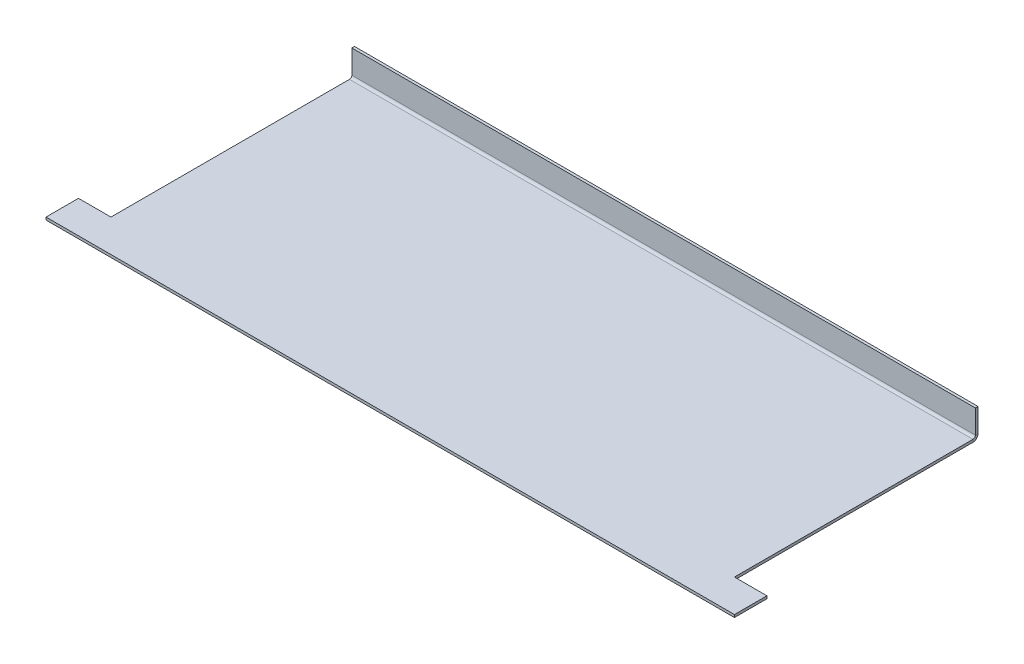
ISO-10303-21;
HEADER;
FILE_DESCRIPTION(('STEP AP214'),'2;1');
FILE_NAME('part.step','',(''),(''),'','','');
FILE_SCHEMA(('AUTOMOTIVE_DESIGN { 1 0 10303 214 1 1 1 1 }'));
ENDSEC;
DATA;
#1=APPLICATION_CONTEXT('core data for automotive mechanical design processes');
#2=APPLICATION_PROTOCOL_DEFINITION('international standard','automotive_design',2000,#1);
#3=PRODUCT_CONTEXT('',#1,'mechanical');
#4=PRODUCT('Part','Part','',(#3));
#5=PRODUCT_RELATED_PRODUCT_CATEGORY('part','',(#4));
#6=PRODUCT_DEFINITION_FORMATION('','',#4);
#7=PRODUCT_DEFINITION_CONTEXT('part definition',#1,'design');
#8=PRODUCT_DEFINITION('design','',#6,#7);
#9=PRODUCT_DEFINITION_SHAPE('','',#8);
#10=(LENGTH_UNIT() NAMED_UNIT(*) SI_UNIT(.MILLI.,.METRE.));
#11=(NAMED_UNIT(*) PLANE_ANGLE_UNIT() SI_UNIT($,.RADIAN.));
#12=(NAMED_UNIT(*) SI_UNIT($,.STERADIAN.) SOLID_ANGLE_UNIT());
#13=UNCERTAINTY_MEASURE_WITH_UNIT(LENGTH_MEASURE(1.E-05),#10,'distance_accuracy_value','');
#14=(GEOMETRIC_REPRESENTATION_CONTEXT(3) GLOBAL_UNCERTAINTY_ASSIGNED_CONTEXT((#13)) GLOBAL_UNIT_ASSIGNED_CONTEXT((#10,
#11,#12)) REPRESENTATION_CONTEXT('',''));
#15=CARTESIAN_POINT('',(0.,0.,0.));
#16=DIRECTION('',(0.,0.,1.));
#17=DIRECTION('',(1.,0.,0.));
#18=AXIS2_PLACEMENT_3D('',#15,#16,#17);
#19=CARTESIAN_POINT('',(0.,-0.81,0.));
#20=DIRECTION('',(0.,-1.,0.));
#21=DIRECTION('',(0.,0.,-1.));
#22=AXIS2_PLACEMENT_3D('',#19,#20,#21);
#23=PLANE('',#22);
#24=DIRECTION('',(0.,0.,-1.));
#25=VECTOR('',#24,1.);
#26=CARTESIAN_POINT('',(10.,-0.81,-85.));
#27=LINE('',#26,#25);
#28=CARTESIAN_POINT('',(10.,-0.81,-9.99999999999998));
#29=VERTEX_POINT('',#28);
#30=CARTESIAN_POINT('',(10.,-0.809999999999991,-83.4534));
#31=VERTEX_POINT('',#30);
#32=EDGE_CURVE('E132',#29,#31,#27,.T.);
#33=ORIENTED_EDGE('',*,*,#32,.T.);
#34=DIRECTION('',(-1.,0.,0.));
#35=VECTOR('',#34,1.);
#36=CARTESIAN_POINT('',(10.,-0.809999999999991,-83.4534));
#37=LINE('',#36,#35);
#38=CARTESIAN_POINT('',(202.,-0.81,-83.4534));
#39=VERTEX_POINT('',#38);
#40=EDGE_CURVE('E171',#31,#39,#37,.F.);
#41=ORIENTED_EDGE('',*,*,#40,.T.);
#42=DIRECTION('',(0.,0.,1.));
#43=VECTOR('',#42,1.);
#44=CARTESIAN_POINT('',(202.,-0.81,-85.));
#45=LINE('',#44,#43);
#46=CARTESIAN_POINT('',(202.,-0.81,-9.99999999999999));
#47=VERTEX_POINT('',#46);
#48=EDGE_CURVE('E148',#39,#47,#45,.T.);
#49=ORIENTED_EDGE('',*,*,#48,.T.);
#50=DIRECTION('',(1.,0.,0.));
#51=VECTOR('',#50,1.);
#52=CARTESIAN_POINT('',(212.,-0.81,-10.));
#53=LINE('',#52,#51);
#54=CARTESIAN_POINT('',(212.,-0.81,-10.));
#55=VERTEX_POINT('',#54);
#56=EDGE_CURVE('E145',#47,#55,#53,.T.);
#57=ORIENTED_EDGE('',*,*,#56,.T.);
#58=DIRECTION('',(0.,0.,-1.));
#59=VECTOR('',#58,1.);
#60=CARTESIAN_POINT('',(212.,-0.81,0.));
#61=LINE('',#60,#59);
#62=CARTESIAN_POINT('',(212.,-0.81,0.));
#63=VERTEX_POINT('',#62);
#64=EDGE_CURVE('E117',#63,#55,#61,.T.);
#65=ORIENTED_EDGE('',*,*,#64,.F.);
#66=DIRECTION('',(1.,0.,0.));
#67=VECTOR('',#66,1.);
#68=CARTESIAN_POINT('',(0.,-0.81,0.));
#69=LINE('',#68,#67);
#70=CARTESIAN_POINT('',(0.,-0.81,0.));
#71=VERTEX_POINT('',#70);
#72=EDGE_CURVE('E96',#71,#63,#69,.T.);
#73=ORIENTED_EDGE('',*,*,#72,.F.);
#74=DIRECTION('',(0.,0.,1.));
#75=VECTOR('',#74,1.);
#76=CARTESIAN_POINT('',(0.,-0.81,0.));
#77=LINE('',#76,#75);
#78=CARTESIAN_POINT('',(0.,-0.81,-9.99999999999998));
#79=VERTEX_POINT('',#78);
#80=EDGE_CURVE('E106',#79,#71,#77,.T.);
#81=ORIENTED_EDGE('',*,*,#80,.F.);
#82=DIRECTION('',(1.,0.,0.));
#83=VECTOR('',#82,1.);
#84=CARTESIAN_POINT('',(0.,-0.81,-9.99999999999998));
#85=LINE('',#84,#83);
#86=EDGE_CURVE('E114',#79,#29,#85,.T.);
#87=ORIENTED_EDGE('',*,*,#86,.T.);
#88=EDGE_LOOP('',(#33,#41,#49,#57,#65,#73,#81,#87));
#89=FACE_BOUND('',#88,.T.);
#90=ADVANCED_FACE('F56',(#89),#23,.T.);
#91=CARTESIAN_POINT('',(0.,0.,0.));
#92=DIRECTION('',(0.,-1.,0.));
#93=DIRECTION('',(0.,0.,-1.));
#94=AXIS2_PLACEMENT_3D('',#91,#92,#93);
#95=PLANE('',#94);
#96=DIRECTION('',(-1.,0.,0.));
#97=VECTOR('',#96,1.);
#98=CARTESIAN_POINT('',(10.,0.,-83.4534));
#99=LINE('',#98,#97);
#100=CARTESIAN_POINT('',(10.,0.,-83.4534));
#101=VERTEX_POINT('',#100);
#102=CARTESIAN_POINT('',(202.,0.,-83.4534));
#103=VERTEX_POINT('',#102);
#104=EDGE_CURVE('E161',#101,#103,#99,.F.);
#105=ORIENTED_EDGE('',*,*,#104,.F.);
#106=DIRECTION('',(0.,0.,-1.));
#107=VECTOR('',#106,1.);
#108=CARTESIAN_POINT('',(10.,0.,-85.));
#109=LINE('',#108,#107);
#110=CARTESIAN_POINT('',(10.,0.,-9.99999999999998));
#111=VERTEX_POINT('',#110);
#112=EDGE_CURVE('E125',#111,#101,#109,.T.);
#113=ORIENTED_EDGE('',*,*,#112,.F.);
#114=DIRECTION('',(1.,0.,0.));
#115=VECTOR('',#114,1.);
#116=CARTESIAN_POINT('',(0.,0.,-9.99999999999998));
#117=LINE('',#116,#115);
#118=CARTESIAN_POINT('',(0.,0.,-9.99999999999998));
#119=VERTEX_POINT('',#118);
#120=EDGE_CURVE('E130',#119,#111,#117,.T.);
#121=ORIENTED_EDGE('',*,*,#120,.F.);
#122=DIRECTION('',(0.,0.,1.));
#123=VECTOR('',#122,1.);
#124=CARTESIAN_POINT('',(0.,0.,0.));
#125=LINE('',#124,#123);
#126=CARTESIAN_POINT('',(0.,0.,0.));
#127=VERTEX_POINT('',#126);
#128=EDGE_CURVE('E111',#119,#127,#125,.T.);
#129=ORIENTED_EDGE('',*,*,#128,.T.);
#130=DIRECTION('',(1.,0.,0.));
#131=VECTOR('',#130,1.);
#132=CARTESIAN_POINT('',(0.,0.,0.));
#133=LINE('',#132,#131);
#134=CARTESIAN_POINT('',(212.,0.,0.));
#135=VERTEX_POINT('',#134);
#136=EDGE_CURVE('E94',#127,#135,#133,.T.);
#137=ORIENTED_EDGE('',*,*,#136,.T.);
#138=DIRECTION('',(0.,0.,-1.));
#139=VECTOR('',#138,1.);
#140=CARTESIAN_POINT('',(212.,0.,0.));
#141=LINE('',#140,#139);
#142=CARTESIAN_POINT('',(212.,0.,-10.));
#143=VERTEX_POINT('',#142);
#144=EDGE_CURVE('E99',#135,#143,#141,.T.);
#145=ORIENTED_EDGE('',*,*,#144,.T.);
#146=DIRECTION('',(1.,0.,0.));
#147=VECTOR('',#146,1.);
#148=CARTESIAN_POINT('',(212.,0.,-10.));
#149=LINE('',#148,#147);
#150=CARTESIAN_POINT('',(202.,0.,-10.));
#151=VERTEX_POINT('',#150);
#152=EDGE_CURVE('E138',#151,#143,#149,.T.);
#153=ORIENTED_EDGE('',*,*,#152,.F.);
#154=DIRECTION('',(0.,0.,1.));
#155=VECTOR('',#154,1.);
#156=CARTESIAN_POINT('',(202.,0.,-85.));
#157=LINE('',#156,#155);
#158=EDGE_CURVE('E142',#103,#151,#157,.T.);
#159=ORIENTED_EDGE('',*,*,#158,.F.);
#160=EDGE_LOOP('',(#105,#113,#121,#129,#137,#145,#153,#159));
#161=FACE_BOUND('',#160,.T.);
#162=ADVANCED_FACE('F109',(#161),#95,.F.);
#163=CARTESIAN_POINT('',(10.,-0.811,-85.));
#164=DIRECTION('',(1.,0.,0.));
#165=DIRECTION('',(0.,0.,-1.));
#166=AXIS2_PLACEMENT_3D('',#163,#164,#165);
#167=PLANE('',#166);
#168=DIRECTION('',(0.,-1.,0.));
#169=VECTOR('',#168,1.);
#170=CARTESIAN_POINT('',(10.,0.,-83.4534));
#171=LINE('',#170,#169);
#172=EDGE_CURVE('E152',#101,#31,#171,.T.);
#173=ORIENTED_EDGE('',*,*,#172,.T.);
#174=ORIENTED_EDGE('',*,*,#32,.F.);
#175=DIRECTION('',(0.,1.,0.));
#176=VECTOR('',#175,1.);
#177=CARTESIAN_POINT('',(10.,-0.811,-9.99999999999998));
#178=LINE('',#177,#176);
#179=EDGE_CURVE('E123',#29,#111,#178,.T.);
#180=ORIENTED_EDGE('',*,*,#179,.T.);
#181=ORIENTED_EDGE('',*,*,#112,.T.);
#182=EDGE_LOOP('',(#173,#174,#180,#181));
#183=FACE_BOUND('',#182,.T.);
#184=ADVANCED_FACE('F263',(#183),#167,.F.);
#185=CARTESIAN_POINT('',(202.,-0.811,-85.));
#186=DIRECTION('',(-1.,0.,0.));
#187=DIRECTION('',(0.,0.,1.));
#188=AXIS2_PLACEMENT_3D('',#185,#186,#187);
#189=PLANE('',#188);
#190=DIRECTION('',(0.,-1.,0.));
#191=VECTOR('',#190,1.);
#192=CARTESIAN_POINT('',(202.,0.,-83.4534));
#193=LINE('',#192,#191);
#194=EDGE_CURVE('E151',#103,#39,#193,.T.);
#195=ORIENTED_EDGE('',*,*,#194,.F.);
#196=ORIENTED_EDGE('',*,*,#158,.T.);
#197=DIRECTION('',(0.,1.,0.));
#198=VECTOR('',#197,1.);
#199=CARTESIAN_POINT('',(202.,-0.811,-10.));
#200=LINE('',#199,#198);
#201=EDGE_CURVE('E135',#47,#151,#200,.T.);
#202=ORIENTED_EDGE('',*,*,#201,.F.);
#203=ORIENTED_EDGE('',*,*,#48,.F.);
#204=EDGE_LOOP('',(#195,#196,#202,#203));
#205=FACE_BOUND('',#204,.T.);
#206=ADVANCED_FACE('F271',(#205),#189,.F.);
#207=CARTESIAN_POINT('',(0.,-0.81,0.));
#208=DIRECTION('',(-1.,0.,0.));
#209=DIRECTION('',(0.,0.,1.));
#210=AXIS2_PLACEMENT_3D('',#207,#208,#209);
#211=PLANE('',#210);
#212=DIRECTION('',(0.,1.,0.));
#213=VECTOR('',#212,1.);
#214=CARTESIAN_POINT('',(0.,-0.811,-9.99999999999998));
#215=LINE('',#214,#213);
#216=EDGE_CURVE('E71',#79,#119,#215,.T.);
#217=ORIENTED_EDGE('',*,*,#216,.F.);
#218=ORIENTED_EDGE('',*,*,#80,.T.);
#219=DIRECTION('',(0.,1.,0.));
#220=VECTOR('',#219,1.);
#221=CARTESIAN_POINT('',(0.,-0.81,0.));
#222=LINE('',#221,#220);
#223=EDGE_CURVE('E60',#71,#127,#222,.T.);
#224=ORIENTED_EDGE('',*,*,#223,.T.);
#225=ORIENTED_EDGE('',*,*,#128,.F.);
#226=EDGE_LOOP('',(#217,#218,#224,#225));
#227=FACE_BOUND('',#226,.T.);
#228=ADVANCED_FACE('F58',(#227),#211,.T.);
#229=CARTESIAN_POINT('',(212.,-0.81,0.));
#230=DIRECTION('',(1.,0.,0.));
#231=DIRECTION('',(0.,0.,-1.));
#232=AXIS2_PLACEMENT_3D('',#229,#230,#231);
#233=PLANE('',#232);
#234=DIRECTION('',(0.,1.,0.));
#235=VECTOR('',#234,1.);
#236=CARTESIAN_POINT('',(212.,-0.811,-10.));
#237=LINE('',#236,#235);
#238=EDGE_CURVE('E103',#55,#143,#237,.T.);
#239=ORIENTED_EDGE('',*,*,#238,.T.);
#240=ORIENTED_EDGE('',*,*,#144,.F.);
#241=DIRECTION('',(0.,1.,0.));
#242=VECTOR('',#241,1.);
#243=CARTESIAN_POINT('',(212.,-0.81,0.));
#244=LINE('',#243,#242);
#245=EDGE_CURVE('E13',#63,#135,#244,.T.);
#246=ORIENTED_EDGE('',*,*,#245,.F.);
#247=ORIENTED_EDGE('',*,*,#64,.T.);
#248=EDGE_LOOP('',(#239,#240,#246,#247));
#249=FACE_BOUND('',#248,.T.);
#250=ADVANCED_FACE('F100',(#249),#233,.T.);
#251=CARTESIAN_POINT('',(0.,-0.81,0.));
#252=DIRECTION('',(0.,0.,1.));
#253=DIRECTION('',(1.,0.,0.));
#254=AXIS2_PLACEMENT_3D('',#251,#252,#253);
#255=PLANE('',#254);
#256=ORIENTED_EDGE('',*,*,#136,.F.);
#257=ORIENTED_EDGE('',*,*,#223,.F.);
#258=ORIENTED_EDGE('',*,*,#72,.T.);
#259=ORIENTED_EDGE('',*,*,#245,.T.);
#260=EDGE_LOOP('',(#256,#257,#258,#259));
#261=FACE_BOUND('',#260,.T.);
#262=ADVANCED_FACE('F91',(#261),#255,.T.);
#263=CARTESIAN_POINT('',(0.,-0.811,-9.99999999999998));
#264=DIRECTION('',(0.,0.,1.));
#265=DIRECTION('',(1.,0.,0.));
#266=AXIS2_PLACEMENT_3D('',#263,#264,#265);
#267=PLANE('',#266);
#268=ORIENTED_EDGE('',*,*,#216,.T.);
#269=ORIENTED_EDGE('',*,*,#120,.T.);
#270=ORIENTED_EDGE('',*,*,#179,.F.);
#271=ORIENTED_EDGE('',*,*,#86,.F.);
#272=EDGE_LOOP('',(#268,#269,#270,#271));
#273=FACE_BOUND('',#272,.T.);
#274=ADVANCED_FACE('F266',(#273),#267,.F.);
#275=CARTESIAN_POINT('',(212.,-0.811,-10.));
#276=DIRECTION('',(0.,0.,1.));
#277=DIRECTION('',(1.,0.,0.));
#278=AXIS2_PLACEMENT_3D('',#275,#276,#277);
#279=PLANE('',#278);
#280=ORIENTED_EDGE('',*,*,#201,.T.);
#281=ORIENTED_EDGE('',*,*,#152,.T.);
#282=ORIENTED_EDGE('',*,*,#238,.F.);
#283=ORIENTED_EDGE('',*,*,#56,.F.);
#284=EDGE_LOOP('',(#280,#281,#282,#283));
#285=FACE_BOUND('',#284,.T.);
#286=ADVANCED_FACE('F291',(#285),#279,.F.);
#287=CARTESIAN_POINT('',(202.,0.736599999999999,-83.4534));
#288=DIRECTION('',(1.,0.,0.));
#289=DIRECTION('',(0.,1.,0.));
#290=AXIS2_PLACEMENT_3D('',#287,#288,#289);
#291=PLANE('',#290);
#292=DIRECTION('',(0.,0.,1.));
#293=VECTOR('',#292,1.);
#294=CARTESIAN_POINT('',(202.,0.73660000000001,-85.));
#295=LINE('',#294,#293);
#296=CARTESIAN_POINT('',(202.,0.736599999999996,-84.19));
#297=VERTEX_POINT('',#296);
#298=CARTESIAN_POINT('',(202.,0.736599999999993,-85.));
#299=VERTEX_POINT('',#298);
#300=EDGE_CURVE('E176',#297,#299,#295,.F.);
#301=ORIENTED_EDGE('',*,*,#300,.F.);
#302=CARTESIAN_POINT('',(202.,0.736599999999999,-83.4534));
#303=DIRECTION('',(-1.,0.,0.));
#304=DIRECTION('',(0.,-1.,0.));
#305=AXIS2_PLACEMENT_3D('',#302,#303,#304);
#306=CIRCLE('',#305,0.736600000000004);
#307=EDGE_CURVE('E165',#103,#297,#306,.F.);
#308=ORIENTED_EDGE('',*,*,#307,.F.);
#309=ORIENTED_EDGE('',*,*,#194,.T.);
#310=CARTESIAN_POINT('',(202.,0.736599999999999,-83.4534));
#311=DIRECTION('',(-1.,0.,0.));
#312=DIRECTION('',(0.,-1.,0.));
#313=AXIS2_PLACEMENT_3D('',#310,#311,#312);
#314=CIRCLE('',#313,1.5466);
#315=EDGE_CURVE('E155',#39,#299,#314,.F.);
#316=ORIENTED_EDGE('',*,*,#315,.T.);
#317=EDGE_LOOP('',(#301,#308,#309,#316));
#318=FACE_BOUND('',#317,.T.);
#319=ADVANCED_FACE('F295',(#318),#291,.T.);
#320=CARTESIAN_POINT('',(10.,0.736600000000013,-83.4534));
#321=DIRECTION('',(1.,0.,0.));
#322=DIRECTION('',(0.,1.,0.));
#323=AXIS2_PLACEMENT_3D('',#320,#321,#322);
#324=PLANE('',#323);
#325=CARTESIAN_POINT('',(10.,0.736600000000013,-83.4534));
#326=DIRECTION('',(-1.,0.,0.));
#327=DIRECTION('',(0.,-1.,0.));
#328=AXIS2_PLACEMENT_3D('',#325,#326,#327);
#329=CIRCLE('',#328,0.736600000000004);
#330=CARTESIAN_POINT('',(10.,0.73660000000001,-84.19));
#331=VERTEX_POINT('',#330);
#332=EDGE_CURVE('E158',#331,#101,#329,.T.);
#333=ORIENTED_EDGE('',*,*,#332,.F.);
#334=DIRECTION('',(0.,0.,1.));
#335=VECTOR('',#334,1.);
#336=CARTESIAN_POINT('',(10.,0.736600000000018,-84.19));
#337=LINE('',#336,#335);
#338=CARTESIAN_POINT('',(10.,0.736600000000023,-85.));
#339=VERTEX_POINT('',#338);
#340=EDGE_CURVE('E182',#331,#339,#337,.F.);
#341=ORIENTED_EDGE('',*,*,#340,.T.);
#342=CARTESIAN_POINT('',(10.,0.736600000000013,-83.4534));
#343=DIRECTION('',(-1.,0.,0.));
#344=DIRECTION('',(0.,-1.,0.));
#345=AXIS2_PLACEMENT_3D('',#342,#343,#344);
#346=CIRCLE('',#345,1.5466);
#347=EDGE_CURVE('E168',#339,#31,#346,.T.);
#348=ORIENTED_EDGE('',*,*,#347,.T.);
#349=ORIENTED_EDGE('',*,*,#172,.F.);
#350=EDGE_LOOP('',(#333,#341,#348,#349));
#351=FACE_BOUND('',#350,.T.);
#352=ADVANCED_FACE('F301',(#351),#324,.F.);
#353=CARTESIAN_POINT('',(10.,0.736600000000013,-83.4534));
#354=DIRECTION('',(-1.,0.,0.));
#355=DIRECTION('',(0.,0.,-1.));
#356=AXIS2_PLACEMENT_3D('',#353,#354,#355);
#357=CYLINDRICAL_SURFACE('',#356,1.5466);
#358=ORIENTED_EDGE('',*,*,#40,.F.);
#359=ORIENTED_EDGE('',*,*,#347,.F.);
#360=DIRECTION('',(-1.,0.,0.));
#361=VECTOR('',#360,1.);
#362=CARTESIAN_POINT('',(202.,0.73660000000001,-85.));
#363=LINE('',#362,#361);
#364=EDGE_CURVE('E185',#339,#299,#363,.F.);
#365=ORIENTED_EDGE('',*,*,#364,.T.);
#366=ORIENTED_EDGE('',*,*,#315,.F.);
#367=EDGE_LOOP('',(#358,#359,#365,#366));
#368=FACE_BOUND('',#367,.T.);
#369=ADVANCED_FACE('F331',(#368),#357,.T.);
#370=CARTESIAN_POINT('',(10.,0.736600000000013,-83.4534));
#371=DIRECTION('',(-1.,0.,0.));
#372=DIRECTION('',(0.,0.,-1.));
#373=AXIS2_PLACEMENT_3D('',#370,#371,#372);
#374=CYLINDRICAL_SURFACE('',#373,0.736600000000004);
#375=ORIENTED_EDGE('',*,*,#104,.T.);
#376=ORIENTED_EDGE('',*,*,#307,.T.);
#377=DIRECTION('',(-1.,0.,0.));
#378=VECTOR('',#377,1.);
#379=CARTESIAN_POINT('',(202.,0.736600000000004,-84.19));
#380=LINE('',#379,#378);
#381=EDGE_CURVE('E179',#297,#331,#380,.T.);
#382=ORIENTED_EDGE('',*,*,#381,.T.);
#383=ORIENTED_EDGE('',*,*,#332,.T.);
#384=EDGE_LOOP('',(#375,#376,#382,#383));
#385=FACE_BOUND('',#384,.T.);
#386=ADVANCED_FACE('F341',(#385),#374,.F.);
#387=CARTESIAN_POINT('',(202.,0.,-85.));
#388=DIRECTION('',(-1.,0.,0.));
#389=DIRECTION('',(0.,0.,1.));
#390=AXIS2_PLACEMENT_3D('',#387,#388,#389);
#391=PLANE('',#390);
#392=ORIENTED_EDGE('',*,*,#300,.T.);
#393=DIRECTION('',(0.,-1.,0.));
#394=VECTOR('',#393,1.);
#395=CARTESIAN_POINT('',(202.,-2.9773109080052E-13,-85.));
#396=LINE('',#395,#394);
#397=CARTESIAN_POINT('',(202.,8.,-85.));
#398=VERTEX_POINT('',#397);
#399=EDGE_CURVE('E197',#398,#299,#396,.T.);
#400=ORIENTED_EDGE('',*,*,#399,.F.);
#401=DIRECTION('',(0.,0.,1.));
#402=VECTOR('',#401,1.);
#403=CARTESIAN_POINT('',(202.,8.,-85.));
#404=LINE('',#403,#402);
#405=CARTESIAN_POINT('',(202.,8.00000000000001,-84.19));
#406=VERTEX_POINT('',#405);
#407=EDGE_CURVE('E206',#398,#406,#404,.T.);
#408=ORIENTED_EDGE('',*,*,#407,.T.);
#409=DIRECTION('',(0.,1.,0.));
#410=VECTOR('',#409,1.);
#411=CARTESIAN_POINT('',(202.,0.,-84.19));
#412=LINE('',#411,#410);
#413=EDGE_CURVE('E188',#406,#297,#412,.F.);
#414=ORIENTED_EDGE('',*,*,#413,.T.);
#415=EDGE_LOOP('',(#392,#400,#408,#414));
#416=FACE_BOUND('',#415,.T.);
#417=ADVANCED_FACE('F232',(#416),#391,.F.);
#418=CARTESIAN_POINT('',(10.,8.,-85.));
#419=DIRECTION('',(1.,0.,0.));
#420=DIRECTION('',(0.,0.,-1.));
#421=AXIS2_PLACEMENT_3D('',#418,#419,#420);
#422=PLANE('',#421);
#423=ORIENTED_EDGE('',*,*,#340,.F.);
#424=DIRECTION('',(0.,-1.,0.));
#425=VECTOR('',#424,1.);
#426=CARTESIAN_POINT('',(10.,8.00000000000001,-84.19));
#427=LINE('',#426,#425);
#428=CARTESIAN_POINT('',(10.,8.00000000000001,-84.19));
#429=VERTEX_POINT('',#428);
#430=EDGE_CURVE('E191',#331,#429,#427,.F.);
#431=ORIENTED_EDGE('',*,*,#430,.T.);
#432=DIRECTION('',(0.,0.,1.));
#433=VECTOR('',#432,1.);
#434=CARTESIAN_POINT('',(10.,8.,-85.));
#435=LINE('',#434,#433);
#436=CARTESIAN_POINT('',(10.,8.,-85.));
#437=VERTEX_POINT('',#436);
#438=EDGE_CURVE('E162',#437,#429,#435,.T.);
#439=ORIENTED_EDGE('',*,*,#438,.F.);
#440=DIRECTION('',(0.,1.,0.));
#441=VECTOR('',#440,1.);
#442=CARTESIAN_POINT('',(10.,-2.9773109080052E-13,-85.));
#443=LINE('',#442,#441);
#444=EDGE_CURVE('E200',#339,#437,#443,.T.);
#445=ORIENTED_EDGE('',*,*,#444,.F.);
#446=EDGE_LOOP('',(#423,#431,#439,#445));
#447=FACE_BOUND('',#446,.T.);
#448=ADVANCED_FACE('F362',(#447),#422,.F.);
#449=CARTESIAN_POINT('',(0.,-2.9773109080052E-13,-85.));
#450=DIRECTION('',(0.,0.,1.));
#451=DIRECTION('',(0.,-1.,0.));
#452=AXIS2_PLACEMENT_3D('',#449,#450,#451);
#453=PLANE('',#452);
#454=ORIENTED_EDGE('',*,*,#364,.F.);
#455=ORIENTED_EDGE('',*,*,#444,.T.);
#456=DIRECTION('',(1.,0.,0.));
#457=VECTOR('',#456,1.);
#458=CARTESIAN_POINT('',(0.,8.,-85.));
#459=LINE('',#458,#457);
#460=EDGE_CURVE('E203',#437,#398,#459,.T.);
#461=ORIENTED_EDGE('',*,*,#460,.T.);
#462=ORIENTED_EDGE('',*,*,#399,.T.);
#463=EDGE_LOOP('',(#454,#455,#461,#462));
#464=FACE_BOUND('',#463,.T.);
#465=ADVANCED_FACE('F372',(#464),#453,.F.);
#466=CARTESIAN_POINT('',(0.,-2.94902990916057E-13,-84.19));
#467=DIRECTION('',(0.,0.,1.));
#468=DIRECTION('',(0.,-1.,0.));
#469=AXIS2_PLACEMENT_3D('',#466,#467,#468);
#470=PLANE('',#469);
#471=ORIENTED_EDGE('',*,*,#430,.F.);
#472=ORIENTED_EDGE('',*,*,#381,.F.);
#473=ORIENTED_EDGE('',*,*,#413,.F.);
#474=DIRECTION('',(-1.,0.,0.));
#475=VECTOR('',#474,1.);
#476=CARTESIAN_POINT('',(202.,8.00000000000001,-84.19));
#477=LINE('',#476,#475);
#478=EDGE_CURVE('E194',#429,#406,#477,.F.);
#479=ORIENTED_EDGE('',*,*,#478,.F.);
#480=EDGE_LOOP('',(#471,#472,#473,#479));
#481=FACE_BOUND('',#480,.T.);
#482=ADVANCED_FACE('F226',(#481),#470,.T.);
#483=CARTESIAN_POINT('',(202.,8.,-85.));
#484=DIRECTION('',(0.,-1.,0.));
#485=DIRECTION('',(0.,0.,-1.));
#486=AXIS2_PLACEMENT_3D('',#483,#484,#485);
#487=PLANE('',#486);
#488=ORIENTED_EDGE('',*,*,#478,.T.);
#489=ORIENTED_EDGE('',*,*,#407,.F.);
#490=ORIENTED_EDGE('',*,*,#460,.F.);
#491=ORIENTED_EDGE('',*,*,#438,.T.);
#492=EDGE_LOOP('',(#488,#489,#490,#491));
#493=FACE_BOUND('',#492,.T.);
#494=ADVANCED_FACE('F215',(#493),#487,.F.);
#495=CLOSED_SHELL('',(#90,#162,#184,#206,#228,#250,#262,#274,#286,#319,#352,#369,#386,#417,#448,
#465,#482,#494));
#496=MANIFOLD_SOLID_BREP('B2',#495);
#497=ADVANCED_BREP_SHAPE_REPRESENTATION('',(#18,#496),#14);
#498=SHAPE_DEFINITION_REPRESENTATION(#9,#497);
ENDSEC;
END-ISO-10303-21;
